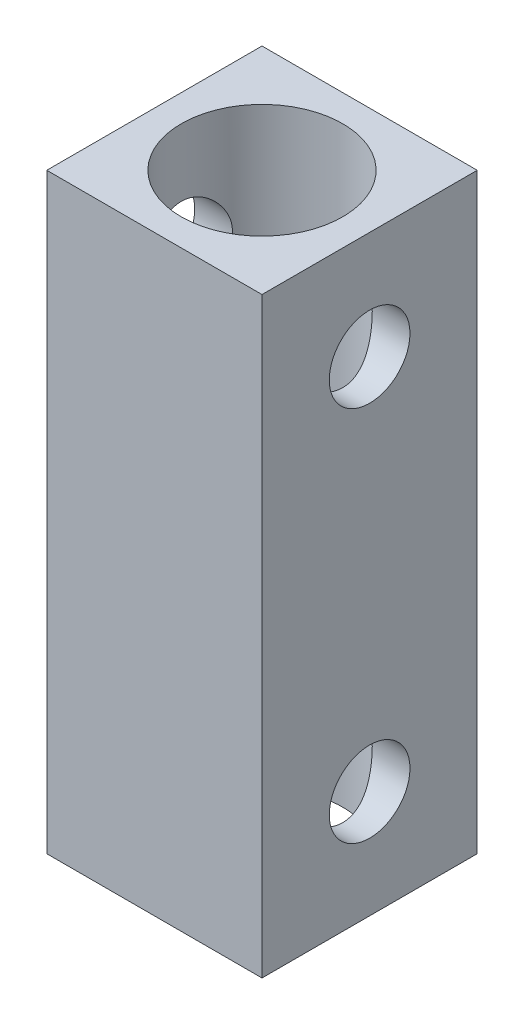
ISO-10303-21;
HEADER;
FILE_DESCRIPTION(('STEP AP214'),'2;1');
FILE_NAME('part.step','',(''),(''),'','','');
FILE_SCHEMA(('AUTOMOTIVE_DESIGN { 1 0 10303 214 1 1 1 1 }'));
ENDSEC;
DATA;
#1=APPLICATION_CONTEXT('core data for automotive mechanical design processes');
#2=APPLICATION_PROTOCOL_DEFINITION('international standard','automotive_design',2000,#1);
#3=PRODUCT_CONTEXT('',#1,'mechanical');
#4=PRODUCT('Part','Part','',(#3));
#5=PRODUCT_RELATED_PRODUCT_CATEGORY('part','',(#4));
#6=PRODUCT_DEFINITION_FORMATION('','',#4);
#7=PRODUCT_DEFINITION_CONTEXT('part definition',#1,'design');
#8=PRODUCT_DEFINITION('design','',#6,#7);
#9=PRODUCT_DEFINITION_SHAPE('','',#8);
#10=(LENGTH_UNIT() NAMED_UNIT(*) SI_UNIT(.MILLI.,.METRE.));
#11=(NAMED_UNIT(*) PLANE_ANGLE_UNIT() SI_UNIT($,.RADIAN.));
#12=(NAMED_UNIT(*) SI_UNIT($,.STERADIAN.) SOLID_ANGLE_UNIT());
#13=UNCERTAINTY_MEASURE_WITH_UNIT(LENGTH_MEASURE(1.E-05),#10,'distance_accuracy_value','');
#14=(GEOMETRIC_REPRESENTATION_CONTEXT(3) GLOBAL_UNCERTAINTY_ASSIGNED_CONTEXT((#13)) GLOBAL_UNIT_ASSIGNED_CONTEXT((#10,
#11,#12)) REPRESENTATION_CONTEXT('',''));
#15=CARTESIAN_POINT('',(0.,0.,0.));
#16=DIRECTION('',(0.,0.,1.));
#17=DIRECTION('',(1.,0.,0.));
#18=AXIS2_PLACEMENT_3D('',#15,#16,#17);
#19=CARTESIAN_POINT('',(0.,22.,0.));
#20=DIRECTION('',(0.,-1.,0.));
#21=DIRECTION('',(0.,0.,-1.));
#22=AXIS2_PLACEMENT_3D('',#19,#20,#21);
#23=PLANE('',#22);
#24=DIRECTION('',(0.,0.,-1.));
#25=VECTOR('',#24,1.);
#26=CARTESIAN_POINT('',(4.,22.,4.));
#27=LINE('',#26,#25);
#28=CARTESIAN_POINT('',(4.,22.,4.));
#29=VERTEX_POINT('',#28);
#30=CARTESIAN_POINT('',(4.,22.,-4.));
#31=VERTEX_POINT('',#30);
#32=EDGE_CURVE('E92',#29,#31,#27,.T.);
#33=ORIENTED_EDGE('',*,*,#32,.T.);
#34=DIRECTION('',(-1.,0.,0.));
#35=VECTOR('',#34,1.);
#36=CARTESIAN_POINT('',(-4.,22.,-4.));
#37=LINE('',#36,#35);
#38=CARTESIAN_POINT('',(-4.,22.,-4.));
#39=VERTEX_POINT('',#38);
#40=EDGE_CURVE('E87',#31,#39,#37,.T.);
#41=ORIENTED_EDGE('',*,*,#40,.T.);
#42=DIRECTION('',(0.,0.,1.));
#43=VECTOR('',#42,1.);
#44=CARTESIAN_POINT('',(-4.,22.,4.));
#45=LINE('',#44,#43);
#46=CARTESIAN_POINT('',(-4.,22.,4.));
#47=VERTEX_POINT('',#46);
#48=EDGE_CURVE('E90',#39,#47,#45,.T.);
#49=ORIENTED_EDGE('',*,*,#48,.T.);
#50=DIRECTION('',(1.,0.,0.));
#51=VECTOR('',#50,1.);
#52=CARTESIAN_POINT('',(-4.,22.,4.));
#53=LINE('',#52,#51);
#54=EDGE_CURVE('E57',#47,#29,#53,.T.);
#55=ORIENTED_EDGE('',*,*,#54,.T.);
#56=EDGE_LOOP('',(#33,#41,#49,#55));
#57=FACE_BOUND('',#56,.T.);
#58=CARTESIAN_POINT('',(0.,22.,0.));
#59=DIRECTION('',(0.,1.,0.));
#60=DIRECTION('',(0.,0.,1.));
#61=AXIS2_PLACEMENT_3D('',#58,#59,#60);
#62=CIRCLE('',#61,3.);
#63=CARTESIAN_POINT('',(0.,22.,3.));
#64=VERTEX_POINT('',#63);
#65=EDGE_CURVE('E108',#64,#64,#62,.T.);
#66=ORIENTED_EDGE('',*,*,#65,.F.);
#67=EDGE_LOOP('',(#66));
#68=FACE_BOUND('',#67,.T.);
#69=ADVANCED_FACE('F33',(#57,#68),#23,.F.);
#70=CARTESIAN_POINT('',(0.,0.,0.));
#71=DIRECTION('',(0.,-1.,0.));
#72=DIRECTION('',(0.,0.,-1.));
#73=AXIS2_PLACEMENT_3D('',#70,#71,#72);
#74=PLANE('',#73);
#75=DIRECTION('',(0.,0.,-1.));
#76=VECTOR('',#75,1.);
#77=CARTESIAN_POINT('',(4.,0.,4.));
#78=LINE('',#77,#76);
#79=CARTESIAN_POINT('',(4.,0.,4.));
#80=VERTEX_POINT('',#79);
#81=CARTESIAN_POINT('',(4.,0.,-4.));
#82=VERTEX_POINT('',#81);
#83=EDGE_CURVE('E105',#80,#82,#78,.T.);
#84=ORIENTED_EDGE('',*,*,#83,.F.);
#85=DIRECTION('',(1.,0.,0.));
#86=VECTOR('',#85,1.);
#87=CARTESIAN_POINT('',(-4.,0.,4.));
#88=LINE('',#87,#86);
#89=CARTESIAN_POINT('',(-4.,0.,4.));
#90=VERTEX_POINT('',#89);
#91=EDGE_CURVE('E80',#90,#80,#88,.T.);
#92=ORIENTED_EDGE('',*,*,#91,.F.);
#93=DIRECTION('',(0.,0.,1.));
#94=VECTOR('',#93,1.);
#95=CARTESIAN_POINT('',(-4.,0.,4.));
#96=LINE('',#95,#94);
#97=CARTESIAN_POINT('',(-4.,0.,-4.));
#98=VERTEX_POINT('',#97);
#99=EDGE_CURVE('E74',#98,#90,#96,.T.);
#100=ORIENTED_EDGE('',*,*,#99,.F.);
#101=DIRECTION('',(-1.,0.,0.));
#102=VECTOR('',#101,1.);
#103=CARTESIAN_POINT('',(-4.,0.,-4.));
#104=LINE('',#103,#102);
#105=EDGE_CURVE('E96',#82,#98,#104,.T.);
#106=ORIENTED_EDGE('',*,*,#105,.F.);
#107=EDGE_LOOP('',(#84,#92,#100,#106));
#108=FACE_BOUND('',#107,.T.);
#109=CARTESIAN_POINT('',(0.,0.,0.));
#110=DIRECTION('',(0.,1.,0.));
#111=DIRECTION('',(0.,0.,1.));
#112=AXIS2_PLACEMENT_3D('',#109,#110,#111);
#113=CIRCLE('',#112,3.);
#114=CARTESIAN_POINT('',(0.,0.,3.));
#115=VERTEX_POINT('',#114);
#116=EDGE_CURVE('E148',#115,#115,#113,.T.);
#117=ORIENTED_EDGE('',*,*,#116,.T.);
#118=EDGE_LOOP('',(#117));
#119=FACE_BOUND('',#118,.T.);
#120=ADVANCED_FACE('F184',(#108,#119),#74,.T.);
#121=CARTESIAN_POINT('',(4.,22.,4.));
#122=DIRECTION('',(-1.,0.,0.));
#123=DIRECTION('',(0.,0.,1.));
#124=AXIS2_PLACEMENT_3D('',#121,#122,#123);
#125=PLANE('',#124);
#126=CARTESIAN_POINT('',(4.,18.,0.));
#127=DIRECTION('',(1.,0.,0.));
#128=DIRECTION('',(0.,0.,-1.));
#129=AXIS2_PLACEMENT_3D('',#126,#127,#128);
#130=CIRCLE('',#129,1.5);
#131=CARTESIAN_POINT('',(4.,18.,-1.5));
#132=VERTEX_POINT('',#131);
#133=EDGE_CURVE('E172',#132,#132,#130,.T.);
#134=ORIENTED_EDGE('',*,*,#133,.F.);
#135=EDGE_LOOP('',(#134));
#136=FACE_BOUND('',#135,.T.);
#137=CARTESIAN_POINT('',(4.,4.00000000000001,0.));
#138=DIRECTION('',(1.,0.,0.));
#139=DIRECTION('',(0.,0.,1.));
#140=AXIS2_PLACEMENT_3D('',#137,#138,#139);
#141=CIRCLE('',#140,1.5);
#142=CARTESIAN_POINT('',(4.,4.00000000000001,1.5));
#143=VERTEX_POINT('',#142);
#144=EDGE_CURVE('E173',#143,#143,#141,.T.);
#145=ORIENTED_EDGE('',*,*,#144,.F.);
#146=EDGE_LOOP('',(#145));
#147=FACE_BOUND('',#146,.T.);
#148=ORIENTED_EDGE('',*,*,#83,.T.);
#149=DIRECTION('',(0.,-1.,0.));
#150=VECTOR('',#149,1.);
#151=CARTESIAN_POINT('',(4.,22.,-4.));
#152=LINE('',#151,#150);
#153=EDGE_CURVE('E11',#31,#82,#152,.T.);
#154=ORIENTED_EDGE('',*,*,#153,.F.);
#155=ORIENTED_EDGE('',*,*,#32,.F.);
#156=DIRECTION('',(0.,-1.,0.));
#157=VECTOR('',#156,1.);
#158=CARTESIAN_POINT('',(4.,22.,4.));
#159=LINE('',#158,#157);
#160=EDGE_CURVE('E101',#29,#80,#159,.T.);
#161=ORIENTED_EDGE('',*,*,#160,.T.);
#162=EDGE_LOOP('',(#148,#154,#155,#161));
#163=FACE_BOUND('',#162,.T.);
#164=ADVANCED_FACE('F35',(#136,#147,#163),#125,.F.);
#165=CARTESIAN_POINT('',(-4.,22.,-4.));
#166=DIRECTION('',(0.,0.,1.));
#167=DIRECTION('',(1.,0.,0.));
#168=AXIS2_PLACEMENT_3D('',#165,#166,#167);
#169=PLANE('',#168);
#170=ORIENTED_EDGE('',*,*,#105,.T.);
#171=DIRECTION('',(0.,-1.,0.));
#172=VECTOR('',#171,1.);
#173=CARTESIAN_POINT('',(-4.,22.,-4.));
#174=LINE('',#173,#172);
#175=EDGE_CURVE('E48',#39,#98,#174,.T.);
#176=ORIENTED_EDGE('',*,*,#175,.F.);
#177=ORIENTED_EDGE('',*,*,#40,.F.);
#178=ORIENTED_EDGE('',*,*,#153,.T.);
#179=EDGE_LOOP('',(#170,#176,#177,#178));
#180=FACE_BOUND('',#179,.T.);
#181=ADVANCED_FACE('F95',(#180),#169,.F.);
#182=CARTESIAN_POINT('',(-4.,22.,4.));
#183=DIRECTION('',(1.,0.,0.));
#184=DIRECTION('',(0.,0.,-1.));
#185=AXIS2_PLACEMENT_3D('',#182,#183,#184);
#186=PLANE('',#185);
#187=CARTESIAN_POINT('',(-4.,18.,0.));
#188=DIRECTION('',(1.,0.,0.));
#189=DIRECTION('',(0.,0.,-1.));
#190=AXIS2_PLACEMENT_3D('',#187,#188,#189);
#191=CIRCLE('',#190,1.5);
#192=CARTESIAN_POINT('',(-4.,18.,-1.5));
#193=VERTEX_POINT('',#192);
#194=EDGE_CURVE('E122',#193,#193,#191,.F.);
#195=ORIENTED_EDGE('',*,*,#194,.F.);
#196=EDGE_LOOP('',(#195));
#197=FACE_BOUND('',#196,.T.);
#198=CARTESIAN_POINT('',(-4.,4.00000000000001,0.));
#199=DIRECTION('',(1.,0.,0.));
#200=DIRECTION('',(0.,0.,-1.));
#201=AXIS2_PLACEMENT_3D('',#198,#199,#200);
#202=CIRCLE('',#201,1.5);
#203=CARTESIAN_POINT('',(-4.,4.00000000000001,-1.5));
#204=VERTEX_POINT('',#203);
#205=EDGE_CURVE('E169',#204,#204,#202,.F.);
#206=ORIENTED_EDGE('',*,*,#205,.F.);
#207=EDGE_LOOP('',(#206));
#208=FACE_BOUND('',#207,.T.);
#209=ORIENTED_EDGE('',*,*,#99,.T.);
#210=DIRECTION('',(0.,-1.,0.));
#211=VECTOR('',#210,1.);
#212=CARTESIAN_POINT('',(-4.,22.,4.));
#213=LINE('',#212,#211);
#214=EDGE_CURVE('E97',#47,#90,#213,.T.);
#215=ORIENTED_EDGE('',*,*,#214,.F.);
#216=ORIENTED_EDGE('',*,*,#48,.F.);
#217=ORIENTED_EDGE('',*,*,#175,.T.);
#218=EDGE_LOOP('',(#209,#215,#216,#217));
#219=FACE_BOUND('',#218,.T.);
#220=ADVANCED_FACE('F99',(#197,#208,#219),#186,.F.);
#221=CARTESIAN_POINT('',(-4.,22.,4.));
#222=DIRECTION('',(0.,0.,-1.));
#223=DIRECTION('',(-1.,0.,0.));
#224=AXIS2_PLACEMENT_3D('',#221,#222,#223);
#225=PLANE('',#224);
#226=ORIENTED_EDGE('',*,*,#91,.T.);
#227=ORIENTED_EDGE('',*,*,#160,.F.);
#228=ORIENTED_EDGE('',*,*,#54,.F.);
#229=ORIENTED_EDGE('',*,*,#214,.T.);
#230=EDGE_LOOP('',(#226,#227,#228,#229));
#231=FACE_BOUND('',#230,.T.);
#232=ADVANCED_FACE('F156',(#231),#225,.F.);
#233=CARTESIAN_POINT('',(0.,22.,0.));
#234=DIRECTION('',(0.,-1.,0.));
#235=DIRECTION('',(0.,0.,-1.));
#236=AXIS2_PLACEMENT_3D('',#233,#234,#235);
#237=CYLINDRICAL_SURFACE('',#236,3.);
#238=CARTESIAN_POINT('',(-2.59807621135332,18.,-1.5));
#239=CARTESIAN_POINT('',(-2.59808302092689,18.0781617122929,-1.4999945446118));
#240=CARTESIAN_POINT('',(-2.60165701781635,18.1564221172876,-1.49384995609983));
#241=CARTESIAN_POINT('',(-2.61543549678079,18.3105408970157,-1.46958481484708));
#242=CARTESIAN_POINT('',(-2.62565391083339,18.3863938725651,-1.45143909683127));
#243=CARTESIAN_POINT('',(-2.65124019908098,18.5331774965159,-1.40414992304972));
#244=CARTESIAN_POINT('',(-2.66658065209878,18.6041319787104,-1.3750649287406));
#245=CARTESIAN_POINT('',(-2.70063997225287,18.7401363029951,-1.30690128806456));
#246=CARTESIAN_POINT('',(-2.71935902214097,18.8051858253937,-1.26782210105366));
#247=CARTESIAN_POINT('',(-2.75995303586162,18.9334585928363,-1.17699981079632));
#248=CARTESIAN_POINT('',(-2.78196095456931,18.9960887035103,-1.12447805421566));
#249=CARTESIAN_POINT('',(-2.82557974178559,19.1121125826101,-1.0098807114217));
#250=CARTESIAN_POINT('',(-2.84719040746875,19.1655017438753,-0.947800388673441));
#251=CARTESIAN_POINT('',(-2.88932215429424,19.2650507267215,-0.81073434512182));
#252=CARTESIAN_POINT('',(-2.90967159627259,19.3104806517893,-0.735160783518862));
#253=CARTESIAN_POINT('',(-2.94526134149294,19.3877112798686,-0.576235539899256));
#254=CARTESIAN_POINT('',(-2.96050486775613,19.4195205842058,-0.492888807207232));
#255=CARTESIAN_POINT('',(-2.98320691866356,19.4662569919516,-0.327067415888965));
#256=CARTESIAN_POINT('',(-2.99114220331338,19.4822242895333,-0.244952685733226));
#257=CARTESIAN_POINT('',(-3.00011375769101,19.5002491780126,-0.0788559430467716));
#258=CARTESIAN_POINT('',(-3.00115420176885,19.5023151851936,0.00512490876560816));
#259=CARTESIAN_POINT('',(-2.99644472874675,19.4928799890445,0.164748786635625));
#260=CARTESIAN_POINT('',(-2.99127743838241,19.4825429767182,0.240481798765188));
#261=CARTESIAN_POINT('',(-2.97561367889621,19.450678734143,0.388970657877483));
#262=CARTESIAN_POINT('',(-2.96511681099591,19.4291506665357,0.461726281640888));
#263=CARTESIAN_POINT('',(-2.93957374931482,19.3753761508653,0.60346408735433));
#264=CARTESIAN_POINT('',(-2.92446662293799,19.3429855302419,0.672380135272767));
#265=CARTESIAN_POINT('',(-2.89106468980031,19.2686048756978,0.803965202269992));
#266=CARTESIAN_POINT('',(-2.87276874236226,19.2266114050465,0.866631973257968));
#267=CARTESIAN_POINT('',(-2.83266591598844,19.1296569727005,0.990260491347292));
#268=CARTESIAN_POINT('',(-2.81069063997263,19.073845457511,1.05050111254404));
#269=CARTESIAN_POINT('',(-2.76681510880218,18.9531154126047,1.16115655544667));
#270=CARTESIAN_POINT('',(-2.74491492398443,18.8881899415889,1.21156381736135));
#271=CARTESIAN_POINT('',(-2.70216234138727,18.7460277113639,1.30425800196332));
#272=CARTESIAN_POINT('',(-2.68146479986061,18.6682709654187,1.34582597246708));
#273=CARTESIAN_POINT('',(-2.64563175417864,18.5055934929615,1.41497866950185));
#274=CARTESIAN_POINT('',(-2.63049045069101,18.4206803504737,1.44257798731634));
#275=CARTESIAN_POINT('',(-2.60916953725552,18.2531782330758,1.48077031653756));
#276=CARTESIAN_POINT('',(-2.60237483772745,18.1709383214347,1.49253768317996));
#277=CARTESIAN_POINT('',(-2.59676879042414,18.0053979877252,1.50227541991714));
#278=CARTESIAN_POINT('',(-2.59795180333967,17.9220983563203,1.50025553597254));
#279=CARTESIAN_POINT('',(-2.60751504810877,17.7665191221319,1.48355406501595));
#280=CARTESIAN_POINT('',(-2.61509381259981,17.6940308233381,1.4702817250687));
#281=CARTESIAN_POINT('',(-2.63541032327012,17.5524483205936,1.43354442694866));
#282=CARTESIAN_POINT('',(-2.64814974007551,17.4833552238801,1.41007616793542));
#283=CARTESIAN_POINT('',(-2.67804333119485,17.346883003646,1.35247138290733));
#284=CARTESIAN_POINT('',(-2.69537464864595,17.2797314747197,1.31789109553909));
#285=CARTESIAN_POINT('',(-2.73234179245875,17.1517960926915,1.23943059602371));
#286=CARTESIAN_POINT('',(-2.75197880032721,17.0910155347301,1.19554560649833));
#287=CARTESIAN_POINT('',(-2.79431997684504,16.9695318487147,1.09325575079828));
#288=CARTESIAN_POINT('',(-2.81709874731434,16.9098042739235,1.03371790847245));
#289=CARTESIAN_POINT('',(-2.86101352466839,16.8008816430096,0.905106743097435));
#290=CARTESIAN_POINT('',(-2.88214897511564,16.7516901446542,0.836030211983023));
#291=CARTESIAN_POINT('',(-2.92112042536435,16.6641394110748,0.687803043838139));
#292=CARTESIAN_POINT('',(-2.93885462508044,16.6261003226836,0.608434646361173));
#293=CARTESIAN_POINT('',(-2.96825032438952,16.5642931442139,0.443283546961625));
#294=CARTESIAN_POINT('',(-2.9799171551456,16.5405125229505,0.357506552088264));
#295=CARTESIAN_POINT('',(-2.99501262272824,16.509947153738,0.190469523495625));
#296=CARTESIAN_POINT('',(-2.99909891862287,16.5018031861858,0.109517165775686));
#297=CARTESIAN_POINT('',(-3.00063195562697,16.4987351018184,-0.0526889789268052));
#298=CARTESIAN_POINT('',(-2.99808102100335,16.5038063572146,-0.13394265044263));
#299=CARTESIAN_POINT('',(-2.98700953256884,16.5261246101934,-0.288806988475721));
#300=CARTESIAN_POINT('',(-2.97889342001985,16.5425472738865,-0.362568476716896));
#301=CARTESIAN_POINT('',(-2.95788140495135,16.5859904989545,-0.506168928275426));
#302=CARTESIAN_POINT('',(-2.94498481699194,16.6130125801402,-0.576007327433263));
#303=CARTESIAN_POINT('',(-2.9148889612218,16.678090578249,-0.713135109367326));
#304=CARTESIAN_POINT('',(-2.89752925798199,16.7165689848118,-0.780187714050068));
#305=CARTESIAN_POINT('',(-2.86032199712739,16.8029368962886,-0.907161962721036));
#306=CARTESIAN_POINT('',(-2.84047329837541,16.8508307236735,-0.967080311122361));
#307=CARTESIAN_POINT('',(-2.79792915339942,16.9601957085341,-1.08437100623534));
#308=CARTESIAN_POINT('',(-2.77514698517547,17.0225437312158,-1.14089652680891));
#309=CARTESIAN_POINT('',(-2.73094614244279,17.1561760816947,-1.24299493109202));
#310=CARTESIAN_POINT('',(-2.70952868642798,17.2274682313015,-1.28855812501509));
#311=CARTESIAN_POINT('',(-2.66999407957374,17.3799549698714,-1.36864661967848));
#312=CARTESIAN_POINT('',(-2.65200261384405,17.4613912966931,-1.40277759894141));
#313=CARTESIAN_POINT('',(-2.62299234492528,17.6299986065097,-1.45631806425962));
#314=CARTESIAN_POINT('',(-2.61195024221553,17.717149333369,-1.47577678676302));
#315=CARTESIAN_POINT('',(-2.60293908902686,17.837708033478,-1.49155051179662));
#316=CARTESIAN_POINT('',(-2.60112193507728,17.8700518415968,-1.49471415744578));
#317=CARTESIAN_POINT('',(-2.59868903831625,17.9349247210234,-1.49894010763495));
#318=CARTESIAN_POINT('',(-2.59807337587664,17.9674538045788,-1.50000227159981));
#319=CARTESIAN_POINT('',(-2.59807621135332,18.,-1.5));
#320=B_SPLINE_CURVE_WITH_KNOTS('',3,(#238,#239,#240,#241,#242,#243,#244,#245,#246,#247,#248,
#249,#250,#251,#252,#253,#254,#255,#256,#257,#258,#259,#260,#261,#262,#263,#264,#265,#266,#267,
#268,#269,#270,#271,#272,#273,#274,#275,#276,#277,#278,#279,#280,#281,#282,#283,#284,#285,#286,
#287,#288,#289,#290,#291,#292,#293,#294,#295,#296,#297,#298,#299,#300,#301,#302,#303,#304,#305,
#306,#307,#308,#309,#310,#311,#312,#313,#314,#315,#316,#317,#318,#319),.UNSPECIFIED.,.T.,.F.,(4,
2,2,2,2,2,2,2,2,2,2,2,2,2,2,2,2,2,2,2,2,2,2,2,2,2,2,2,2,2,2,2,2,2,2,2,2,2,2,2,4),(0.,
0.234348183892075,0.469189339237207,0.702792893878331,0.936409088167727,1.18929346874735,
1.44230356626557,1.71236838358145,1.98226240445837,2.23295227451903,2.4834903552906,
2.71224146226808,2.94100968776183,3.1729430209672,3.40495949025408,3.65890787185336,
3.91305072368878,4.18333262594173,4.45333161317558,4.70193436281318,4.9503613978256,
5.17161275136039,5.39293578654095,5.62450944609132,5.85620229330072,6.1171011537092,
6.37808797467304,6.64596272119449,6.91360169713158,7.15668405584231,7.39968130190958,
7.6266663730724,7.8536840026802,8.09041126079208,8.3272474515108,8.58765362775102,
8.84828914267732,9.11716123557908,9.38512699504141,9.48270202777965,9.58028358741812),.UNSPECIFIED.);
#321=CARTESIAN_POINT('',(-2.59807621135332,18.,-1.5));
#322=VERTEX_POINT('',#321);
#323=EDGE_CURVE('E37',#322,#322,#320,.T.);
#324=ORIENTED_EDGE('',*,*,#323,.F.);
#325=EDGE_LOOP('',(#324));
#326=FACE_BOUND('',#325,.T.);
#327=CARTESIAN_POINT('',(2.59807621135332,18.,-1.5));
#328=CARTESIAN_POINT('',(2.59808302092689,17.9218382877071,-1.4999945446118));
#329=CARTESIAN_POINT('',(2.60165701781635,17.8435778827124,-1.49384995609983));
#330=CARTESIAN_POINT('',(2.61543549678079,17.6894591029843,-1.46958481484708));
#331=CARTESIAN_POINT('',(2.62565391083339,17.6136061274349,-1.45143909683127));
#332=CARTESIAN_POINT('',(2.65124019908098,17.4668225034841,-1.40414992304972));
#333=CARTESIAN_POINT('',(2.66658065209878,17.3958680212896,-1.3750649287406));
#334=CARTESIAN_POINT('',(2.70063997225287,17.2598636970049,-1.30690128806456));
#335=CARTESIAN_POINT('',(2.71935902214097,17.1948141746063,-1.26782210105366));
#336=CARTESIAN_POINT('',(2.75995303586162,17.0665414071637,-1.17699981079632));
#337=CARTESIAN_POINT('',(2.7819609545693,17.0039112964897,-1.12447805421566));
#338=CARTESIAN_POINT('',(2.82557974178558,16.8878874173899,-1.0098807114217));
#339=CARTESIAN_POINT('',(2.84719040746875,16.8344982561247,-0.947800388673441));
#340=CARTESIAN_POINT('',(2.88932215429424,16.7349492732785,-0.81073434512182));
#341=CARTESIAN_POINT('',(2.90967159627259,16.6895193482107,-0.735160783518862));
#342=CARTESIAN_POINT('',(2.94526134149293,16.6122887201314,-0.576235539899256));
#343=CARTESIAN_POINT('',(2.96050486775612,16.5804794157942,-0.492888807207232));
#344=CARTESIAN_POINT('',(2.98320691866356,16.5337430080484,-0.327067415888965));
#345=CARTESIAN_POINT('',(2.99114220331338,16.5177757104667,-0.244952685733226));
#346=CARTESIAN_POINT('',(3.000113757691,16.4997508219874,-0.0788559430467716));
#347=CARTESIAN_POINT('',(3.00115420176885,16.4976848148064,0.00512490876560816));
#348=CARTESIAN_POINT('',(2.99644472874675,16.5071200109555,0.164748786635625));
#349=CARTESIAN_POINT('',(2.99127743838241,16.5174570232818,0.240481798765188));
#350=CARTESIAN_POINT('',(2.97561367889621,16.549321265857,0.388970657877483));
#351=CARTESIAN_POINT('',(2.96511681099591,16.5708493334643,0.461726281640888));
#352=CARTESIAN_POINT('',(2.93957374931482,16.6246238491347,0.60346408735433));
#353=CARTESIAN_POINT('',(2.92446662293799,16.6570144697581,0.672380135272767));
#354=CARTESIAN_POINT('',(2.89106468980031,16.7313951243022,0.803965202269992));
#355=CARTESIAN_POINT('',(2.87276874236226,16.7733885949535,0.866631973257968));
#356=CARTESIAN_POINT('',(2.83266591598844,16.8703430272995,0.990260491347293));
#357=CARTESIAN_POINT('',(2.81069063997263,16.926154542489,1.05050111254404));
#358=CARTESIAN_POINT('',(2.76681510880217,17.0468845873953,1.16115655544667));
#359=CARTESIAN_POINT('',(2.74491492398443,17.1118100584111,1.21156381736135));
#360=CARTESIAN_POINT('',(2.70216234138727,17.2539722886361,1.30425800196332));
#361=CARTESIAN_POINT('',(2.68146479986061,17.3317290345813,1.34582597246708));
#362=CARTESIAN_POINT('',(2.64563175417864,17.4944065070385,1.41497866950185));
#363=CARTESIAN_POINT('',(2.63049045069101,17.5793196495263,1.44257798731634));
#364=CARTESIAN_POINT('',(2.60916953725551,17.7468217669242,1.48077031653756));
#365=CARTESIAN_POINT('',(2.60237483772744,17.8290616785653,1.49253768317996));
#366=CARTESIAN_POINT('',(2.59676879042414,17.9946020122748,1.50227541991714));
#367=CARTESIAN_POINT('',(2.59795180333967,18.0779016436797,1.50025553597254));
#368=CARTESIAN_POINT('',(2.60751504810877,18.2334808778681,1.48355406501595));
#369=CARTESIAN_POINT('',(2.61509381259981,18.3059691766619,1.4702817250687));
#370=CARTESIAN_POINT('',(2.63541032327011,18.4475516794064,1.43354442694866));
#371=CARTESIAN_POINT('',(2.6481497400755,18.5166447761199,1.41007616793542));
#372=CARTESIAN_POINT('',(2.67804333119485,18.653116996354,1.35247138290733));
#373=CARTESIAN_POINT('',(2.69537464864595,18.7202685252803,1.31789109553909));
#374=CARTESIAN_POINT('',(2.73234179245874,18.8482039073085,1.23943059602371));
#375=CARTESIAN_POINT('',(2.75197880032721,18.9089844652699,1.19554560649833));
#376=CARTESIAN_POINT('',(2.79431997684504,19.0304681512853,1.09325575079828));
#377=CARTESIAN_POINT('',(2.81709874731433,19.0901957260765,1.03371790847245));
#378=CARTESIAN_POINT('',(2.86101352466839,19.1991183569904,0.905106743097435));
#379=CARTESIAN_POINT('',(2.88214897511564,19.2483098553458,0.836030211983023));
#380=CARTESIAN_POINT('',(2.92112042536435,19.3358605889252,0.687803043838139));
#381=CARTESIAN_POINT('',(2.93885462508044,19.3738996773164,0.608434646361173));
#382=CARTESIAN_POINT('',(2.96825032438951,19.4357068557861,0.443283546961625));
#383=CARTESIAN_POINT('',(2.97991715514559,19.4594874770495,0.357506552088264));
#384=CARTESIAN_POINT('',(2.99501262272824,19.490052846262,0.190469523495625));
#385=CARTESIAN_POINT('',(2.99909891862287,19.4981968138142,0.109517165775686));
#386=CARTESIAN_POINT('',(3.00063195562697,19.5012648981816,-0.0526889789268052));
#387=CARTESIAN_POINT('',(2.99808102100335,19.4961936427853,-0.13394265044263));
#388=CARTESIAN_POINT('',(2.98700953256884,19.4738753898066,-0.288806988475721));
#389=CARTESIAN_POINT('',(2.97889342001985,19.4574527261135,-0.362568476716895));
#390=CARTESIAN_POINT('',(2.95788140495135,19.4140095010455,-0.506168928275426));
#391=CARTESIAN_POINT('',(2.94498481699193,19.3869874198598,-0.576007327433263));
#392=CARTESIAN_POINT('',(2.9148889612218,19.321909421751,-0.713135109367327));
#393=CARTESIAN_POINT('',(2.89752925798199,19.2834310151882,-0.78018771405007));
#394=CARTESIAN_POINT('',(2.86032199712739,19.1970631037114,-0.907161962721038));
#395=CARTESIAN_POINT('',(2.84047329837541,19.1491692763265,-0.967080311122361));
#396=CARTESIAN_POINT('',(2.79792915339941,19.0398042914659,-1.08437100623534));
#397=CARTESIAN_POINT('',(2.77514698517547,18.9774562687842,-1.14089652680891));
#398=CARTESIAN_POINT('',(2.73094614244278,18.8438239183053,-1.24299493109202));
#399=CARTESIAN_POINT('',(2.70952868642798,18.7725317686985,-1.28855812501509));
#400=CARTESIAN_POINT('',(2.66999407957374,18.6200450301286,-1.36864661967848));
#401=CARTESIAN_POINT('',(2.65200261384405,18.5386087033069,-1.40277759894141));
#402=CARTESIAN_POINT('',(2.62299234492527,18.3700013934903,-1.45631806425962));
#403=CARTESIAN_POINT('',(2.61195024221553,18.282850666631,-1.47577678676302));
#404=CARTESIAN_POINT('',(2.60293908902686,18.162291966522,-1.49155051179662));
#405=CARTESIAN_POINT('',(2.60112193507728,18.1299481584032,-1.49471415744578));
#406=CARTESIAN_POINT('',(2.59868903831625,18.0650752789766,-1.49894010763495));
#407=CARTESIAN_POINT('',(2.59807337587664,18.0325461954212,-1.50000227159981));
#408=CARTESIAN_POINT('',(2.59807621135332,18.,-1.5));
#409=B_SPLINE_CURVE_WITH_KNOTS('',3,(#327,#328,#329,#330,#331,#332,#333,#334,#335,#336,#337,
#338,#339,#340,#341,#342,#343,#344,#345,#346,#347,#348,#349,#350,#351,#352,#353,#354,#355,#356,
#357,#358,#359,#360,#361,#362,#363,#364,#365,#366,#367,#368,#369,#370,#371,#372,#373,#374,#375,
#376,#377,#378,#379,#380,#381,#382,#383,#384,#385,#386,#387,#388,#389,#390,#391,#392,#393,#394,
#395,#396,#397,#398,#399,#400,#401,#402,#403,#404,#405,#406,#407,#408),.UNSPECIFIED.,.T.,.F.,(4,
2,2,2,2,2,2,2,2,2,2,2,2,2,2,2,2,2,2,2,2,2,2,2,2,2,2,2,2,2,2,2,2,2,2,2,2,2,2,2,4),(0.,
0.234348183892075,0.469189339237207,0.702792893878331,0.936409088167727,1.18929346874735,
1.44230356626557,1.71236838358145,1.98226240445837,2.23295227451903,2.4834903552906,
2.71224146226808,2.94100968776183,3.1729430209672,3.40495949025408,3.65890787185336,
3.91305072368878,4.18333262594173,4.45333161317558,4.70193436281318,4.9503613978256,
5.17161275136039,5.39293578654095,5.62450944609132,5.85620229330072,6.1171011537092,
6.37808797467304,6.64596272119449,6.91360169713158,7.15668405584231,7.39968130190958,
7.62666637307239,7.8536840026802,8.09041126079209,8.3272474515108,8.58765362775102,
8.84828914267732,9.11716123557908,9.38512699504141,9.48270202777965,9.58028358741812),.UNSPECIFIED.);
#410=CARTESIAN_POINT('',(2.59807621135332,18.,-1.5));
#411=VERTEX_POINT('',#410);
#412=EDGE_CURVE('E141',#411,#411,#409,.T.);
#413=ORIENTED_EDGE('',*,*,#412,.F.);
#414=EDGE_LOOP('',(#413));
#415=FACE_BOUND('',#414,.T.);
#416=CARTESIAN_POINT('',(-2.59807621135332,4.00000000000001,-1.5));
#417=CARTESIAN_POINT('',(-2.59808302092689,4.07816171229288,-1.4999945446118));
#418=CARTESIAN_POINT('',(-2.60165701781635,4.15642211728758,-1.49384995609983));
#419=CARTESIAN_POINT('',(-2.61543549678079,4.31054089701574,-1.46958481484708));
#420=CARTESIAN_POINT('',(-2.62565391083339,4.38639387256512,-1.45143909683127));
#421=CARTESIAN_POINT('',(-2.65124019908098,4.53317749651592,-1.40414992304972));
#422=CARTESIAN_POINT('',(-2.66658065209878,4.60413197871039,-1.3750649287406));
#423=CARTESIAN_POINT('',(-2.70063997225287,4.74013630299509,-1.30690128806456));
#424=CARTESIAN_POINT('',(-2.71935902214097,4.80518582539369,-1.26782210105366));
#425=CARTESIAN_POINT('',(-2.75995303586162,4.93345859283627,-1.17699981079632));
#426=CARTESIAN_POINT('',(-2.78196095456931,4.99608870351032,-1.12447805421566));
#427=CARTESIAN_POINT('',(-2.82557974178559,5.11211258261007,-1.0098807114217));
#428=CARTESIAN_POINT('',(-2.84719040746875,5.16550174387529,-0.947800388673441));
#429=CARTESIAN_POINT('',(-2.88932215429424,5.2650507267215,-0.81073434512182));
#430=CARTESIAN_POINT('',(-2.90967159627259,5.3104806517893,-0.735160783518863));
#431=CARTESIAN_POINT('',(-2.94526134149294,5.38771127986865,-0.576235539899256));
#432=CARTESIAN_POINT('',(-2.96050486775613,5.41952058420576,-0.492888807207233));
#433=CARTESIAN_POINT('',(-2.98320691866356,5.46625699195165,-0.327067415888966));
#434=CARTESIAN_POINT('',(-2.99114220331338,5.48222428953331,-0.244952685733226));
#435=CARTESIAN_POINT('',(-3.00011375769101,5.50024917801256,-0.0788559430467722));
#436=CARTESIAN_POINT('',(-3.00115420176885,5.50231518519357,0.00512490876560777));
#437=CARTESIAN_POINT('',(-2.99644472874675,5.49287998904448,0.164748786635625));
#438=CARTESIAN_POINT('',(-2.99127743838241,5.48254297671818,0.240481798765187));
#439=CARTESIAN_POINT('',(-2.97561367889621,5.45067873414302,0.388970657877483));
#440=CARTESIAN_POINT('',(-2.96511681099591,5.42915066653567,0.461726281640888));
#441=CARTESIAN_POINT('',(-2.93957374931482,5.37537615086529,0.603464087354331));
#442=CARTESIAN_POINT('',(-2.92446662293799,5.34298553024191,0.672380135272768));
#443=CARTESIAN_POINT('',(-2.89106468980031,5.26860487569777,0.803965202269993));
#444=CARTESIAN_POINT('',(-2.87276874236226,5.22661140504648,0.866631973257969));
#445=CARTESIAN_POINT('',(-2.83266591598844,5.12965697270049,0.990260491347293));
#446=CARTESIAN_POINT('',(-2.81069063997263,5.07384545751099,1.05050111254404));
#447=CARTESIAN_POINT('',(-2.76681510880218,4.95311541260474,1.16115655544667));
#448=CARTESIAN_POINT('',(-2.74491492398443,4.88818994158891,1.21156381736135));
#449=CARTESIAN_POINT('',(-2.70216234138727,4.74602771136388,1.30425800196332));
#450=CARTESIAN_POINT('',(-2.68146479986061,4.66827096541869,1.34582597246708));
#451=CARTESIAN_POINT('',(-2.64563175417864,4.50559349296151,1.41497866950185));
#452=CARTESIAN_POINT('',(-2.63049045069101,4.42068035047367,1.44257798731634));
#453=CARTESIAN_POINT('',(-2.60916953725552,4.25317823307582,1.48077031653756));
#454=CARTESIAN_POINT('',(-2.60237483772745,4.17093832143468,1.49253768317997));
#455=CARTESIAN_POINT('',(-2.59676879042414,4.00539798772519,1.50227541991714));
#456=CARTESIAN_POINT('',(-2.59795180333967,3.92209835632033,1.50025553597254));
#457=CARTESIAN_POINT('',(-2.60751504810877,3.76651912213191,1.48355406501595));
#458=CARTESIAN_POINT('',(-2.61509381259981,3.69403082333812,1.4702817250687));
#459=CARTESIAN_POINT('',(-2.63541032327012,3.55244832059357,1.43354442694866));
#460=CARTESIAN_POINT('',(-2.64814974007551,3.48335522388009,1.41007616793542));
#461=CARTESIAN_POINT('',(-2.67804333119485,3.34688300364596,1.35247138290733));
#462=CARTESIAN_POINT('',(-2.69537464864595,3.27973147471968,1.31789109553909));
#463=CARTESIAN_POINT('',(-2.73234179245875,3.15179609269152,1.23943059602371));
#464=CARTESIAN_POINT('',(-2.75197880032721,3.09101553473008,1.19554560649833));
#465=CARTESIAN_POINT('',(-2.79431997684504,2.96953184871468,1.09325575079828));
#466=CARTESIAN_POINT('',(-2.81709874731434,2.90980427392352,1.03371790847245));
#467=CARTESIAN_POINT('',(-2.86101352466839,2.80088164300962,0.905106743097434));
#468=CARTESIAN_POINT('',(-2.88214897511564,2.7516901446542,0.836030211983022));
#469=CARTESIAN_POINT('',(-2.92112042536435,2.66413941107485,0.687803043838137));
#470=CARTESIAN_POINT('',(-2.93885462508044,2.62610032268364,0.608434646361171));
#471=CARTESIAN_POINT('',(-2.96825032438952,2.56429314421392,0.443283546961624));
#472=CARTESIAN_POINT('',(-2.9799171551456,2.54051252295055,0.357506552088264));
#473=CARTESIAN_POINT('',(-2.99501262272824,2.50994715373801,0.190469523495626));
#474=CARTESIAN_POINT('',(-2.99909891862287,2.50180318618584,0.109517165775685));
#475=CARTESIAN_POINT('',(-3.00063195562697,2.4987351018184,-0.0526889789268057));
#476=CARTESIAN_POINT('',(-2.99808102100335,2.50380635721466,-0.13394265044263));
#477=CARTESIAN_POINT('',(-2.98700953256884,2.52612461019344,-0.288806988475721));
#478=CARTESIAN_POINT('',(-2.97889342001985,2.54254727388651,-0.362568476716896));
#479=CARTESIAN_POINT('',(-2.95788140495135,2.58599049895446,-0.506168928275427));
#480=CARTESIAN_POINT('',(-2.94498481699194,2.61301258014019,-0.576007327433264));
#481=CARTESIAN_POINT('',(-2.9148889612218,2.67809057824897,-0.713135109367327));
#482=CARTESIAN_POINT('',(-2.89752925798199,2.71656898481176,-0.780187714050069));
#483=CARTESIAN_POINT('',(-2.86032199712739,2.80293689628858,-0.907161962721037));
#484=CARTESIAN_POINT('',(-2.84047329837541,2.85083072367352,-0.967080311122361));
#485=CARTESIAN_POINT('',(-2.79792915339942,2.96019570853406,-1.08437100623534));
#486=CARTESIAN_POINT('',(-2.77514698517547,3.02254373121579,-1.14089652680891));
#487=CARTESIAN_POINT('',(-2.73094614244279,3.15617608169466,-1.24299493109201));
#488=CARTESIAN_POINT('',(-2.70952868642798,3.22746823130153,-1.28855812501509));
#489=CARTESIAN_POINT('',(-2.66999407957374,3.37995496987144,-1.36864661967848));
#490=CARTESIAN_POINT('',(-2.65200261384406,3.46139129669311,-1.40277759894141));
#491=CARTESIAN_POINT('',(-2.62299234492528,3.62999860650967,-1.45631806425962));
#492=CARTESIAN_POINT('',(-2.61195024221553,3.71714933336904,-1.47577678676302));
#493=CARTESIAN_POINT('',(-2.60293908902686,3.837708033478,-1.49155051179662));
#494=CARTESIAN_POINT('',(-2.60112193507728,3.87005184159683,-1.49471415744578));
#495=CARTESIAN_POINT('',(-2.59868903831625,3.93492472102337,-1.49894010763495));
#496=CARTESIAN_POINT('',(-2.59807337587664,3.96745380457882,-1.50000227159981));
#497=CARTESIAN_POINT('',(-2.59807621135332,4.00000000000001,-1.5));
#498=B_SPLINE_CURVE_WITH_KNOTS('',3,(#416,#417,#418,#419,#420,#421,#422,#423,#424,#425,#426,
#427,#428,#429,#430,#431,#432,#433,#434,#435,#436,#437,#438,#439,#440,#441,#442,#443,#444,#445,
#446,#447,#448,#449,#450,#451,#452,#453,#454,#455,#456,#457,#458,#459,#460,#461,#462,#463,#464,
#465,#466,#467,#468,#469,#470,#471,#472,#473,#474,#475,#476,#477,#478,#479,#480,#481,#482,#483,
#484,#485,#486,#487,#488,#489,#490,#491,#492,#493,#494,#495,#496,#497),.UNSPECIFIED.,.T.,.F.,(4,
2,2,2,2,2,2,2,2,2,2,2,2,2,2,2,2,2,2,2,2,2,2,2,2,2,2,2,2,2,2,2,2,2,2,2,2,2,2,2,4),(0.,
0.234348183892073,0.469189339237207,0.702792893878329,0.936409088167725,1.18929346874735,
1.44230356626557,1.71236838358145,1.98226240445837,2.23295227451903,2.4834903552906,
2.71224146226808,2.94100968776183,3.1729430209672,3.40495949025408,3.65890787185336,
3.91305072368878,4.18333262594173,4.45333161317558,4.70193436281318,4.9503613978256,
5.17161275136039,5.39293578654095,5.62450944609132,5.85620229330071,6.1171011537092,
6.37808797467304,6.64596272119449,6.91360169713158,7.15668405584231,7.39968130190958,
7.62666637307239,7.8536840026802,8.09041126079208,8.32724745151079,8.58765362775102,
8.84828914267732,9.11716123557908,9.38512699504141,9.48270202777964,9.58028358741811),.UNSPECIFIED.);
#499=CARTESIAN_POINT('',(-2.59807621135332,4.00000000000001,-1.5));
#500=VERTEX_POINT('',#499);
#501=EDGE_CURVE('E121',#500,#500,#498,.T.);
#502=ORIENTED_EDGE('',*,*,#501,.F.);
#503=EDGE_LOOP('',(#502));
#504=FACE_BOUND('',#503,.T.);
#505=CARTESIAN_POINT('',(2.59807621135332,4.00000000000001,-1.5));
#506=CARTESIAN_POINT('',(2.59808302092689,3.92183828770713,-1.4999945446118));
#507=CARTESIAN_POINT('',(2.60165701781635,3.84357788271244,-1.49384995609983));
#508=CARTESIAN_POINT('',(2.61543549678079,3.68945910298428,-1.46958481484708));
#509=CARTESIAN_POINT('',(2.62565391083339,3.61360612743489,-1.45143909683127));
#510=CARTESIAN_POINT('',(2.65124019908098,3.46682250348409,-1.40414992304972));
#511=CARTESIAN_POINT('',(2.66658065209878,3.39586802128963,-1.3750649287406));
#512=CARTESIAN_POINT('',(2.70063997225287,3.25986369700493,-1.30690128806456));
#513=CARTESIAN_POINT('',(2.71935902214097,3.19481417460632,-1.26782210105366));
#514=CARTESIAN_POINT('',(2.75995303586162,3.06654140716375,-1.17699981079632));
#515=CARTESIAN_POINT('',(2.7819609545693,3.00391129648969,-1.12447805421566));
#516=CARTESIAN_POINT('',(2.82557974178558,2.88788741738994,-1.0098807114217));
#517=CARTESIAN_POINT('',(2.84719040746875,2.83449825612472,-0.94780038867344));
#518=CARTESIAN_POINT('',(2.88932215429424,2.73494927327851,-0.81073434512182));
#519=CARTESIAN_POINT('',(2.90967159627259,2.68951934821071,-0.735160783518863));
#520=CARTESIAN_POINT('',(2.94526134149293,2.61228872013136,-0.576235539899256));
#521=CARTESIAN_POINT('',(2.96050486775612,2.58047941579425,-0.492888807207233));
#522=CARTESIAN_POINT('',(2.98320691866356,2.53374300804836,-0.327067415888966));
#523=CARTESIAN_POINT('',(2.99114220331338,2.51777571046671,-0.244952685733226));
#524=CARTESIAN_POINT('',(3.000113757691,2.49975082198745,-0.0788559430467721));
#525=CARTESIAN_POINT('',(3.00115420176885,2.49768481480644,0.00512490876560784));
#526=CARTESIAN_POINT('',(2.99644472874675,2.50712001095553,0.164748786635625));
#527=CARTESIAN_POINT('',(2.99127743838241,2.51745702328184,0.240481798765187));
#528=CARTESIAN_POINT('',(2.97561367889621,2.54932126585699,0.388970657877483));
#529=CARTESIAN_POINT('',(2.96511681099591,2.57084933346434,0.461726281640888));
#530=CARTESIAN_POINT('',(2.93957374931482,2.62462384913473,0.603464087354331));
#531=CARTESIAN_POINT('',(2.92446662293799,2.65701446975811,0.672380135272768));
#532=CARTESIAN_POINT('',(2.89106468980031,2.73139512430225,0.803965202269993));
#533=CARTESIAN_POINT('',(2.87276874236226,2.77338859495353,0.866631973257969));
#534=CARTESIAN_POINT('',(2.83266591598844,2.87034302729953,0.990260491347293));
#535=CARTESIAN_POINT('',(2.81069063997263,2.92615454248902,1.05050111254404));
#536=CARTESIAN_POINT('',(2.76681510880217,3.04688458739527,1.16115655544667));
#537=CARTESIAN_POINT('',(2.74491492398443,3.1118100584111,1.21156381736135));
#538=CARTESIAN_POINT('',(2.70216234138727,3.25397228863614,1.30425800196332));
#539=CARTESIAN_POINT('',(2.68146479986061,3.33172903458132,1.34582597246708));
#540=CARTESIAN_POINT('',(2.64563175417864,3.4944065070385,1.41497866950185));
#541=CARTESIAN_POINT('',(2.63049045069101,3.57931964952635,1.44257798731634));
#542=CARTESIAN_POINT('',(2.60916953725551,3.74682176692419,1.48077031653756));
#543=CARTESIAN_POINT('',(2.60237483772744,3.82906167856533,1.49253768317996));
#544=CARTESIAN_POINT('',(2.59676879042414,3.99460201227482,1.50227541991714));
#545=CARTESIAN_POINT('',(2.59795180333967,4.07790164367969,1.50025553597254));
#546=CARTESIAN_POINT('',(2.60751504810877,4.2334808778681,1.48355406501595));
#547=CARTESIAN_POINT('',(2.61509381259981,4.3059691766619,1.4702817250687));
#548=CARTESIAN_POINT('',(2.63541032327011,4.44755167940644,1.43354442694866));
#549=CARTESIAN_POINT('',(2.6481497400755,4.51664477611992,1.41007616793542));
#550=CARTESIAN_POINT('',(2.67804333119485,4.65311699635405,1.35247138290733));
#551=CARTESIAN_POINT('',(2.69537464864595,4.72026852528034,1.31789109553909));
#552=CARTESIAN_POINT('',(2.73234179245874,4.8482039073085,1.23943059602371));
#553=CARTESIAN_POINT('',(2.75197880032721,4.90898446526993,1.19554560649833));
#554=CARTESIAN_POINT('',(2.79431997684504,5.03046815128533,1.09325575079828));
#555=CARTESIAN_POINT('',(2.81709874731433,5.0901957260765,1.03371790847245));
#556=CARTESIAN_POINT('',(2.86101352466839,5.19911835699039,0.905106743097434));
#557=CARTESIAN_POINT('',(2.88214897511564,5.24830985534582,0.836030211983022));
#558=CARTESIAN_POINT('',(2.92112042536435,5.33586058892516,0.687803043838137));
#559=CARTESIAN_POINT('',(2.93885462508044,5.37389967731637,0.60843464636117));
#560=CARTESIAN_POINT('',(2.96825032438951,5.4357068557861,0.443283546961623));
#561=CARTESIAN_POINT('',(2.97991715514559,5.45948747704947,0.357506552088264));
#562=CARTESIAN_POINT('',(2.99501262272824,5.490052846262,0.190469523495626));
#563=CARTESIAN_POINT('',(2.99909891862287,5.49819681381418,0.109517165775686));
#564=CARTESIAN_POINT('',(3.00063195562697,5.50126489818161,-0.0526889789268047));
#565=CARTESIAN_POINT('',(2.99808102100335,5.49619364278535,-0.13394265044263));
#566=CARTESIAN_POINT('',(2.98700953256884,5.47387538980657,-0.28880698847572));
#567=CARTESIAN_POINT('',(2.97889342001985,5.4574527261135,-0.362568476716895));
#568=CARTESIAN_POINT('',(2.95788140495135,5.41400950104555,-0.506168928275426));
#569=CARTESIAN_POINT('',(2.94498481699193,5.38698741985983,-0.576007327433263));
#570=CARTESIAN_POINT('',(2.9148889612218,5.32190942175105,-0.713135109367327));
#571=CARTESIAN_POINT('',(2.89752925798199,5.28343101518825,-0.780187714050069));
#572=CARTESIAN_POINT('',(2.86032199712739,5.19706310371143,-0.907161962721037));
#573=CARTESIAN_POINT('',(2.84047329837541,5.1491692763265,-0.967080311122361));
#574=CARTESIAN_POINT('',(2.79792915339941,5.03980429146595,-1.08437100623534));
#575=CARTESIAN_POINT('',(2.77514698517547,4.97745626878422,-1.14089652680891));
#576=CARTESIAN_POINT('',(2.73094614244278,4.84382391830535,-1.24299493109201));
#577=CARTESIAN_POINT('',(2.70952868642798,4.77253176869848,-1.28855812501509));
#578=CARTESIAN_POINT('',(2.66999407957374,4.62004503012858,-1.36864661967848));
#579=CARTESIAN_POINT('',(2.65200261384405,4.5386087033069,-1.40277759894141));
#580=CARTESIAN_POINT('',(2.62299234492527,4.37000139349034,-1.45631806425962));
#581=CARTESIAN_POINT('',(2.61195024221553,4.28285066663098,-1.47577678676302));
#582=CARTESIAN_POINT('',(2.60293908902686,4.16229196652201,-1.49155051179662));
#583=CARTESIAN_POINT('',(2.60112193507728,4.12994815840318,-1.49471415744578));
#584=CARTESIAN_POINT('',(2.59868903831625,4.06507527897664,-1.49894010763495));
#585=CARTESIAN_POINT('',(2.59807337587664,4.0325461954212,-1.50000227159981));
#586=CARTESIAN_POINT('',(2.59807621135332,4.00000000000001,-1.5));
#587=B_SPLINE_CURVE_WITH_KNOTS('',3,(#505,#506,#507,#508,#509,#510,#511,#512,#513,#514,#515,
#516,#517,#518,#519,#520,#521,#522,#523,#524,#525,#526,#527,#528,#529,#530,#531,#532,#533,#534,
#535,#536,#537,#538,#539,#540,#541,#542,#543,#544,#545,#546,#547,#548,#549,#550,#551,#552,#553,
#554,#555,#556,#557,#558,#559,#560,#561,#562,#563,#564,#565,#566,#567,#568,#569,#570,#571,#572,
#573,#574,#575,#576,#577,#578,#579,#580,#581,#582,#583,#584,#585,#586),.UNSPECIFIED.,.T.,.F.,(4,
2,2,2,2,2,2,2,2,2,2,2,2,2,2,2,2,2,2,2,2,2,2,2,2,2,2,2,2,2,2,2,2,2,2,2,2,2,2,2,4),(0.,
0.234348183892073,0.469189339237208,0.70279289387833,0.936409088167725,1.18929346874735,
1.44230356626557,1.71236838358145,1.98226240445837,2.23295227451903,2.4834903552906,
2.71224146226808,2.94100968776183,3.1729430209672,3.40495949025408,3.65890787185336,
3.91305072368878,4.18333262594173,4.45333161317558,4.70193436281318,4.9503613978256,
5.17161275136039,5.39293578654095,5.62450944609132,5.85620229330071,6.1171011537092,
6.37808797467304,6.64596272119449,6.91360169713158,7.15668405584231,7.39968130190958,
7.62666637307239,7.8536840026802,8.09041126079208,8.32724745151079,8.58765362775102,
8.84828914267732,9.11716123557908,9.38512699504141,9.48270202777965,9.58028358741812),.UNSPECIFIED.);
#588=CARTESIAN_POINT('',(2.59807621135332,4.00000000000001,-1.5));
#589=VERTEX_POINT('',#588);
#590=EDGE_CURVE('E114',#589,#589,#587,.T.);
#591=ORIENTED_EDGE('',*,*,#590,.F.);
#592=EDGE_LOOP('',(#591));
#593=FACE_BOUND('',#592,.T.);
#594=ORIENTED_EDGE('',*,*,#65,.T.);
#595=EDGE_LOOP('',(#594));
#596=FACE_BOUND('',#595,.T.);
#597=ORIENTED_EDGE('',*,*,#116,.F.);
#598=EDGE_LOOP('',(#597));
#599=FACE_BOUND('',#598,.T.);
#600=ADVANCED_FACE('F126',(#326,#415,#504,#593,#596,#599),#237,.F.);
#601=CARTESIAN_POINT('',(-8.24264068711929,4.00000000000001,0.));
#602=DIRECTION('',(1.,0.,0.));
#603=DIRECTION('',(0.,0.,-1.));
#604=AXIS2_PLACEMENT_3D('',#601,#602,#603);
#605=CYLINDRICAL_SURFACE('',#604,1.5);
#606=ORIENTED_EDGE('',*,*,#590,.T.);
#607=EDGE_LOOP('',(#606));
#608=FACE_BOUND('',#607,.T.);
#609=ORIENTED_EDGE('',*,*,#144,.T.);
#610=EDGE_LOOP('',(#609));
#611=FACE_BOUND('',#610,.T.);
#612=ADVANCED_FACE('F129',(#608,#611),#605,.F.);
#613=ORIENTED_EDGE('',*,*,#501,.T.);
#614=EDGE_LOOP('',(#613));
#615=FACE_BOUND('',#614,.T.);
#616=ORIENTED_EDGE('',*,*,#205,.T.);
#617=EDGE_LOOP('',(#616));
#618=FACE_BOUND('',#617,.T.);
#619=ADVANCED_FACE('F132',(#615,#618),#605,.F.);
#620=CARTESIAN_POINT('',(-8.24264068711929,18.,0.));
#621=DIRECTION('',(1.,0.,0.));
#622=DIRECTION('',(0.,0.,-1.));
#623=AXIS2_PLACEMENT_3D('',#620,#621,#622);
#624=CYLINDRICAL_SURFACE('',#623,1.5);
#625=ORIENTED_EDGE('',*,*,#412,.T.);
#626=EDGE_LOOP('',(#625));
#627=FACE_BOUND('',#626,.T.);
#628=ORIENTED_EDGE('',*,*,#133,.T.);
#629=EDGE_LOOP('',(#628));
#630=FACE_BOUND('',#629,.T.);
#631=ADVANCED_FACE('F134',(#627,#630),#624,.F.);
#632=ORIENTED_EDGE('',*,*,#323,.T.);
#633=EDGE_LOOP('',(#632));
#634=FACE_BOUND('',#633,.T.);
#635=ORIENTED_EDGE('',*,*,#194,.T.);
#636=EDGE_LOOP('',(#635));
#637=FACE_BOUND('',#636,.T.);
#638=ADVANCED_FACE('F138',(#634,#637),#624,.F.);
#639=CLOSED_SHELL('',(#69,#120,#164,#181,#220,#232,#600,#612,#619,#631,#638));
#640=MANIFOLD_SOLID_BREP('B2',#639);
#641=ADVANCED_BREP_SHAPE_REPRESENTATION('',(#18,#640),#14);
#642=SHAPE_DEFINITION_REPRESENTATION(#9,#641);
ENDSEC;
END-ISO-10303-21;
